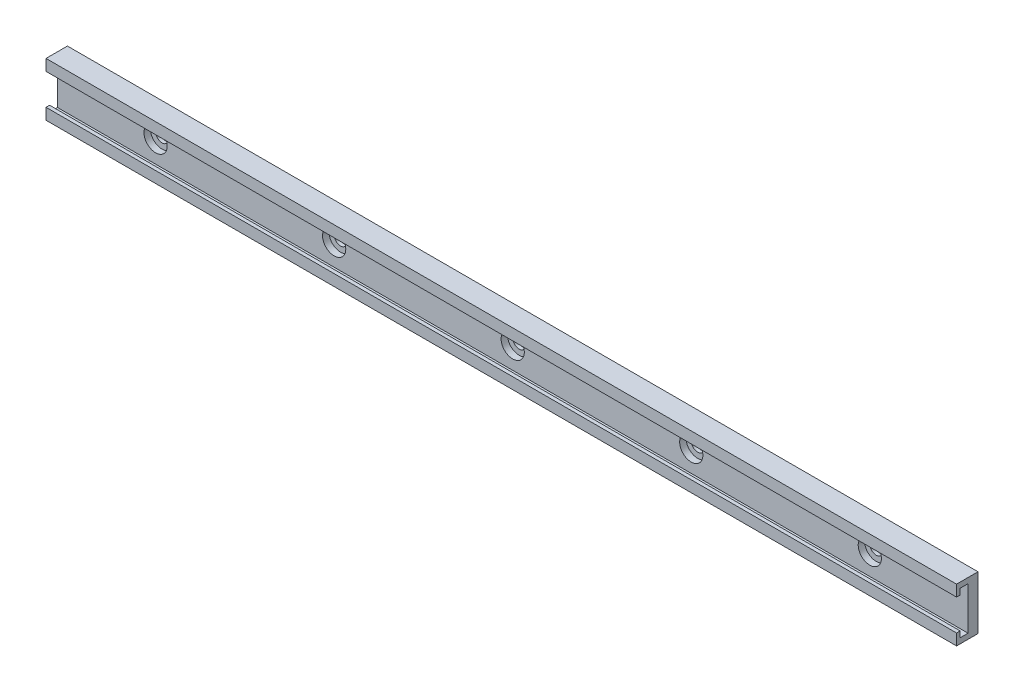
ISO-10303-21;
HEADER;
FILE_DESCRIPTION(('STEP AP214'),'2;1');
FILE_NAME('part.step','',(''),(''),'','','');
FILE_SCHEMA(('AUTOMOTIVE_DESIGN { 1 0 10303 214 1 1 1 1 }'));
ENDSEC;
DATA;
#1=APPLICATION_CONTEXT('core data for automotive mechanical design processes');
#2=APPLICATION_PROTOCOL_DEFINITION('international standard','automotive_design',2000,#1);
#3=PRODUCT_CONTEXT('',#1,'mechanical');
#4=PRODUCT('Part','Part','',(#3));
#5=PRODUCT_RELATED_PRODUCT_CATEGORY('part','',(#4));
#6=PRODUCT_DEFINITION_FORMATION('','',#4);
#7=PRODUCT_DEFINITION_CONTEXT('part definition',#1,'design');
#8=PRODUCT_DEFINITION('design','',#6,#7);
#9=PRODUCT_DEFINITION_SHAPE('','',#8);
#10=(LENGTH_UNIT() NAMED_UNIT(*) SI_UNIT(.MILLI.,.METRE.));
#11=(NAMED_UNIT(*) PLANE_ANGLE_UNIT() SI_UNIT($,.RADIAN.));
#12=(NAMED_UNIT(*) SI_UNIT($,.STERADIAN.) SOLID_ANGLE_UNIT());
#13=UNCERTAINTY_MEASURE_WITH_UNIT(LENGTH_MEASURE(1.E-05),#10,'distance_accuracy_value','');
#14=(GEOMETRIC_REPRESENTATION_CONTEXT(3) GLOBAL_UNCERTAINTY_ASSIGNED_CONTEXT((#13)) GLOBAL_UNIT_ASSIGNED_CONTEXT((#10,
#11,#12)) REPRESENTATION_CONTEXT('',''));
#15=CARTESIAN_POINT('',(0.,0.,0.));
#16=DIRECTION('',(0.,0.,1.));
#17=DIRECTION('',(1.,0.,0.));
#18=AXIS2_PLACEMENT_3D('',#15,#16,#17);
#19=CARTESIAN_POINT('',(127.5,0.,5.));
#20=DIRECTION('',(0.,0.,-1.));
#21=DIRECTION('',(-1.,0.,0.));
#22=AXIS2_PLACEMENT_3D('',#19,#20,#21);
#23=PLANE('',#22);
#24=DIRECTION('',(0.,-1.,0.));
#25=VECTOR('',#24,1.);
#26=CARTESIAN_POINT('',(-127.5,0.,5.));
#27=LINE('',#26,#25);
#28=CARTESIAN_POINT('',(-127.5,-4.35,5.));
#29=VERTEX_POINT('',#28);
#30=CARTESIAN_POINT('',(-127.5,-6.,5.));
#31=VERTEX_POINT('',#30);
#32=EDGE_CURVE('E165',#29,#31,#27,.T.);
#33=ORIENTED_EDGE('',*,*,#32,.F.);
#34=DIRECTION('',(-1.,0.,0.));
#35=VECTOR('',#34,1.);
#36=CARTESIAN_POINT('',(127.5,-4.35,5.));
#37=LINE('',#36,#35);
#38=CARTESIAN_POINT('',(127.5,-4.35,5.));
#39=VERTEX_POINT('',#38);
#40=EDGE_CURVE('E11',#39,#29,#37,.T.);
#41=ORIENTED_EDGE('',*,*,#40,.F.);
#42=DIRECTION('',(0.,-1.,0.));
#43=VECTOR('',#42,1.);
#44=CARTESIAN_POINT('',(127.5,0.,5.));
#45=LINE('',#44,#43);
#46=CARTESIAN_POINT('',(127.5,-6.,5.));
#47=VERTEX_POINT('',#46);
#48=EDGE_CURVE('E207',#39,#47,#45,.T.);
#49=ORIENTED_EDGE('',*,*,#48,.T.);
#50=DIRECTION('',(-1.,0.,0.));
#51=VECTOR('',#50,1.);
#52=CARTESIAN_POINT('',(127.5,-6.,5.));
#53=LINE('',#52,#51);
#54=EDGE_CURVE('E58',#47,#31,#53,.T.);
#55=ORIENTED_EDGE('',*,*,#54,.T.);
#56=EDGE_LOOP('',(#33,#41,#49,#55));
#57=FACE_BOUND('',#56,.T.);
#58=ADVANCED_FACE('F41',(#57),#23,.T.);
#59=CARTESIAN_POINT('',(127.5,-4.35,0.));
#60=DIRECTION('',(0.,-1.,0.));
#61=DIRECTION('',(0.,0.,-1.));
#62=AXIS2_PLACEMENT_3D('',#59,#60,#61);
#63=PLANE('',#62);
#64=DIRECTION('',(0.,0.,1.));
#65=VECTOR('',#64,1.);
#66=CARTESIAN_POINT('',(-127.5,-4.35,0.));
#67=LINE('',#66,#65);
#68=CARTESIAN_POINT('',(-127.5,-4.35,6.));
#69=VERTEX_POINT('',#68);
#70=EDGE_CURVE('E168',#29,#69,#67,.T.);
#71=ORIENTED_EDGE('',*,*,#70,.T.);
#72=DIRECTION('',(-1.,0.,0.));
#73=VECTOR('',#72,1.);
#74=CARTESIAN_POINT('',(127.5,-4.35,6.));
#75=LINE('',#74,#73);
#76=CARTESIAN_POINT('',(127.5,-4.35,6.));
#77=VERTEX_POINT('',#76);
#78=EDGE_CURVE('E50',#77,#69,#75,.T.);
#79=ORIENTED_EDGE('',*,*,#78,.F.);
#80=DIRECTION('',(0.,0.,1.));
#81=VECTOR('',#80,1.);
#82=CARTESIAN_POINT('',(127.5,-4.35,0.));
#83=LINE('',#82,#81);
#84=EDGE_CURVE('E261',#39,#77,#83,.T.);
#85=ORIENTED_EDGE('',*,*,#84,.F.);
#86=ORIENTED_EDGE('',*,*,#40,.T.);
#87=EDGE_LOOP('',(#71,#79,#85,#86));
#88=FACE_BOUND('',#87,.T.);
#89=ADVANCED_FACE('F297',(#88),#63,.F.);
#90=CARTESIAN_POINT('',(127.5,0.,6.));
#91=DIRECTION('',(0.,0.,-1.));
#92=DIRECTION('',(0.,1.,0.));
#93=AXIS2_PLACEMENT_3D('',#90,#91,#92);
#94=PLANE('',#93);
#95=DIRECTION('',(0.,-1.,0.));
#96=VECTOR('',#95,1.);
#97=CARTESIAN_POINT('',(-127.5,0.,6.));
#98=LINE('',#97,#96);
#99=CARTESIAN_POINT('',(-127.5,-7.5,6.));
#100=VERTEX_POINT('',#99);
#101=EDGE_CURVE('E172',#69,#100,#98,.T.);
#102=ORIENTED_EDGE('',*,*,#101,.T.);
#103=DIRECTION('',(-1.,0.,0.));
#104=VECTOR('',#103,1.);
#105=CARTESIAN_POINT('',(127.5,-7.5,6.));
#106=LINE('',#105,#104);
#107=CARTESIAN_POINT('',(127.5,-7.5,6.));
#108=VERTEX_POINT('',#107);
#109=EDGE_CURVE('E229',#108,#100,#106,.T.);
#110=ORIENTED_EDGE('',*,*,#109,.F.);
#111=DIRECTION('',(0.,-1.,0.));
#112=VECTOR('',#111,1.);
#113=CARTESIAN_POINT('',(127.5,0.,6.));
#114=LINE('',#113,#112);
#115=EDGE_CURVE('E240',#77,#108,#114,.T.);
#116=ORIENTED_EDGE('',*,*,#115,.F.);
#117=ORIENTED_EDGE('',*,*,#78,.T.);
#118=EDGE_LOOP('',(#102,#110,#116,#117));
#119=FACE_BOUND('',#118,.T.);
#120=ADVANCED_FACE('F238',(#119),#94,.F.);
#121=CARTESIAN_POINT('',(127.5,-7.5,0.));
#122=DIRECTION('',(0.,1.,0.));
#123=DIRECTION('',(0.,0.,1.));
#124=AXIS2_PLACEMENT_3D('',#121,#122,#123);
#125=PLANE('',#124);
#126=DIRECTION('',(0.,0.,-1.));
#127=VECTOR('',#126,1.);
#128=CARTESIAN_POINT('',(-127.5,-7.5,0.));
#129=LINE('',#128,#127);
#130=CARTESIAN_POINT('',(-127.5,-7.5,0.));
#131=VERTEX_POINT('',#130);
#132=EDGE_CURVE('E175',#100,#131,#129,.T.);
#133=ORIENTED_EDGE('',*,*,#132,.T.);
#134=DIRECTION('',(-1.,0.,0.));
#135=VECTOR('',#134,1.);
#136=CARTESIAN_POINT('',(127.5,-7.5,0.));
#137=LINE('',#136,#135);
#138=CARTESIAN_POINT('',(127.5,-7.5,0.));
#139=VERTEX_POINT('',#138);
#140=EDGE_CURVE('E226',#139,#131,#137,.T.);
#141=ORIENTED_EDGE('',*,*,#140,.F.);
#142=DIRECTION('',(0.,0.,-1.));
#143=VECTOR('',#142,1.);
#144=CARTESIAN_POINT('',(127.5,-7.5,0.));
#145=LINE('',#144,#143);
#146=EDGE_CURVE('E252',#108,#139,#145,.T.);
#147=ORIENTED_EDGE('',*,*,#146,.F.);
#148=ORIENTED_EDGE('',*,*,#109,.T.);
#149=EDGE_LOOP('',(#133,#141,#147,#148));
#150=FACE_BOUND('',#149,.T.);
#151=ADVANCED_FACE('F249',(#150),#125,.F.);
#152=CARTESIAN_POINT('',(127.5,0.,0.));
#153=DIRECTION('',(0.,0.,-1.));
#154=DIRECTION('',(-1.,0.,0.));
#155=AXIS2_PLACEMENT_3D('',#152,#153,#154);
#156=PLANE('',#155);
#157=CARTESIAN_POINT('',(-100.,0.,0.));
#158=DIRECTION('',(0.,0.,1.));
#159=DIRECTION('',(1.,0.,0.));
#160=AXIS2_PLACEMENT_3D('',#157,#158,#159);
#161=CIRCLE('',#160,1.75000000000002);
#162=CARTESIAN_POINT('',(-98.25,0.,0.));
#163=VERTEX_POINT('',#162);
#164=EDGE_CURVE('E391',#163,#163,#161,.T.);
#165=ORIENTED_EDGE('',*,*,#164,.T.);
#166=EDGE_LOOP('',(#165));
#167=FACE_BOUND('',#166,.T.);
#168=CARTESIAN_POINT('',(-50.,0.,0.));
#169=DIRECTION('',(0.,0.,1.));
#170=DIRECTION('',(1.,0.,0.));
#171=AXIS2_PLACEMENT_3D('',#168,#169,#170);
#172=CIRCLE('',#171,1.75000000000002);
#173=CARTESIAN_POINT('',(-48.25,0.,0.));
#174=VERTEX_POINT('',#173);
#175=EDGE_CURVE('E407',#174,#174,#172,.T.);
#176=ORIENTED_EDGE('',*,*,#175,.T.);
#177=EDGE_LOOP('',(#176));
#178=FACE_BOUND('',#177,.T.);
#179=CARTESIAN_POINT('',(0.,0.,0.));
#180=DIRECTION('',(0.,0.,1.));
#181=DIRECTION('',(1.,0.,0.));
#182=AXIS2_PLACEMENT_3D('',#179,#180,#181);
#183=CIRCLE('',#182,1.75000000000001);
#184=CARTESIAN_POINT('',(1.75000000000001,0.,0.));
#185=VERTEX_POINT('',#184);
#186=EDGE_CURVE('E423',#185,#185,#183,.T.);
#187=ORIENTED_EDGE('',*,*,#186,.T.);
#188=EDGE_LOOP('',(#187));
#189=FACE_BOUND('',#188,.T.);
#190=CARTESIAN_POINT('',(50.,0.,0.));
#191=DIRECTION('',(0.,0.,1.));
#192=DIRECTION('',(1.,0.,0.));
#193=AXIS2_PLACEMENT_3D('',#190,#191,#192);
#194=CIRCLE('',#193,1.75000000000002);
#195=CARTESIAN_POINT('',(51.75,0.,0.));
#196=VERTEX_POINT('',#195);
#197=EDGE_CURVE('E439',#196,#196,#194,.T.);
#198=ORIENTED_EDGE('',*,*,#197,.T.);
#199=EDGE_LOOP('',(#198));
#200=FACE_BOUND('',#199,.T.);
#201=CARTESIAN_POINT('',(100.,0.,0.));
#202=DIRECTION('',(0.,0.,1.));
#203=DIRECTION('',(1.,0.,0.));
#204=AXIS2_PLACEMENT_3D('',#201,#202,#203);
#205=CIRCLE('',#204,1.75000000000002);
#206=CARTESIAN_POINT('',(101.75,0.,0.));
#207=VERTEX_POINT('',#206);
#208=EDGE_CURVE('E169',#207,#207,#205,.T.);
#209=ORIENTED_EDGE('',*,*,#208,.T.);
#210=EDGE_LOOP('',(#209));
#211=FACE_BOUND('',#210,.T.);
#212=DIRECTION('',(0.,-1.,0.));
#213=VECTOR('',#212,1.);
#214=CARTESIAN_POINT('',(-127.5,0.,0.));
#215=LINE('',#214,#213);
#216=CARTESIAN_POINT('',(-127.5,7.5,0.));
#217=VERTEX_POINT('',#216);
#218=EDGE_CURVE('E179',#217,#131,#215,.T.);
#219=ORIENTED_EDGE('',*,*,#218,.F.);
#220=DIRECTION('',(-1.,0.,0.));
#221=VECTOR('',#220,1.);
#222=CARTESIAN_POINT('',(127.5,7.5,0.));
#223=LINE('',#222,#221);
#224=CARTESIAN_POINT('',(127.5,7.5,0.));
#225=VERTEX_POINT('',#224);
#226=EDGE_CURVE('E223',#225,#217,#223,.T.);
#227=ORIENTED_EDGE('',*,*,#226,.F.);
#228=DIRECTION('',(0.,-1.,0.));
#229=VECTOR('',#228,1.);
#230=CARTESIAN_POINT('',(127.5,0.,0.));
#231=LINE('',#230,#229);
#232=EDGE_CURVE('E255',#225,#139,#231,.T.);
#233=ORIENTED_EDGE('',*,*,#232,.T.);
#234=ORIENTED_EDGE('',*,*,#140,.T.);
#235=EDGE_LOOP('',(#219,#227,#233,#234));
#236=FACE_BOUND('',#235,.T.);
#237=ADVANCED_FACE('F462',(#167,#178,#189,#200,#211,#236),#156,.T.);
#238=CARTESIAN_POINT('',(127.5,7.5,0.));
#239=DIRECTION('',(0.,1.,0.));
#240=DIRECTION('',(0.,0.,1.));
#241=AXIS2_PLACEMENT_3D('',#238,#239,#240);
#242=PLANE('',#241);
#243=DIRECTION('',(0.,0.,-1.));
#244=VECTOR('',#243,1.);
#245=CARTESIAN_POINT('',(-127.5,7.5,0.));
#246=LINE('',#245,#244);
#247=CARTESIAN_POINT('',(-127.5,7.5,6.));
#248=VERTEX_POINT('',#247);
#249=EDGE_CURVE('E183',#248,#217,#246,.T.);
#250=ORIENTED_EDGE('',*,*,#249,.F.);
#251=DIRECTION('',(-1.,0.,0.));
#252=VECTOR('',#251,1.);
#253=CARTESIAN_POINT('',(127.5,7.5,6.));
#254=LINE('',#253,#252);
#255=CARTESIAN_POINT('',(127.5,7.5,6.));
#256=VERTEX_POINT('',#255);
#257=EDGE_CURVE('E220',#256,#248,#254,.T.);
#258=ORIENTED_EDGE('',*,*,#257,.F.);
#259=DIRECTION('',(0.,0.,-1.));
#260=VECTOR('',#259,1.);
#261=CARTESIAN_POINT('',(127.5,7.5,0.));
#262=LINE('',#261,#260);
#263=EDGE_CURVE('E259',#256,#225,#262,.T.);
#264=ORIENTED_EDGE('',*,*,#263,.T.);
#265=ORIENTED_EDGE('',*,*,#226,.T.);
#266=EDGE_LOOP('',(#250,#258,#264,#265));
#267=FACE_BOUND('',#266,.T.);
#268=ADVANCED_FACE('F472',(#267),#242,.T.);
#269=CARTESIAN_POINT('',(127.5,0.,6.));
#270=DIRECTION('',(0.,0.,1.));
#271=DIRECTION('',(0.,-1.,0.));
#272=AXIS2_PLACEMENT_3D('',#269,#270,#271);
#273=PLANE('',#272);
#274=DIRECTION('',(0.,1.,0.));
#275=VECTOR('',#274,1.);
#276=CARTESIAN_POINT('',(-127.5,0.,6.));
#277=LINE('',#276,#275);
#278=CARTESIAN_POINT('',(-127.5,4.35,6.));
#279=VERTEX_POINT('',#278);
#280=EDGE_CURVE('E187',#279,#248,#277,.T.);
#281=ORIENTED_EDGE('',*,*,#280,.F.);
#282=DIRECTION('',(-1.,0.,0.));
#283=VECTOR('',#282,1.);
#284=CARTESIAN_POINT('',(127.5,4.35,6.));
#285=LINE('',#284,#283);
#286=CARTESIAN_POINT('',(127.5,4.35,6.));
#287=VERTEX_POINT('',#286);
#288=EDGE_CURVE('E217',#287,#279,#285,.T.);
#289=ORIENTED_EDGE('',*,*,#288,.F.);
#290=DIRECTION('',(0.,1.,0.));
#291=VECTOR('',#290,1.);
#292=CARTESIAN_POINT('',(127.5,0.,6.));
#293=LINE('',#292,#291);
#294=EDGE_CURVE('E268',#287,#256,#293,.T.);
#295=ORIENTED_EDGE('',*,*,#294,.T.);
#296=ORIENTED_EDGE('',*,*,#257,.T.);
#297=EDGE_LOOP('',(#281,#289,#295,#296));
#298=FACE_BOUND('',#297,.T.);
#299=ADVANCED_FACE('F283',(#298),#273,.T.);
#300=CARTESIAN_POINT('',(127.5,4.35,0.));
#301=DIRECTION('',(0.,-1.,0.));
#302=DIRECTION('',(0.,0.,-1.));
#303=AXIS2_PLACEMENT_3D('',#300,#301,#302);
#304=PLANE('',#303);
#305=DIRECTION('',(0.,0.,1.));
#306=VECTOR('',#305,1.);
#307=CARTESIAN_POINT('',(-127.5,4.35,0.));
#308=LINE('',#307,#306);
#309=CARTESIAN_POINT('',(-127.5,4.35,5.));
#310=VERTEX_POINT('',#309);
#311=EDGE_CURVE('E191',#310,#279,#308,.T.);
#312=ORIENTED_EDGE('',*,*,#311,.F.);
#313=DIRECTION('',(-1.,0.,0.));
#314=VECTOR('',#313,1.);
#315=CARTESIAN_POINT('',(127.5,4.35,5.));
#316=LINE('',#315,#314);
#317=CARTESIAN_POINT('',(127.5,4.35,5.));
#318=VERTEX_POINT('',#317);
#319=EDGE_CURVE('E214',#318,#310,#316,.T.);
#320=ORIENTED_EDGE('',*,*,#319,.F.);
#321=DIRECTION('',(0.,0.,1.));
#322=VECTOR('',#321,1.);
#323=CARTESIAN_POINT('',(127.5,4.35,0.));
#324=LINE('',#323,#322);
#325=EDGE_CURVE('E272',#318,#287,#324,.T.);
#326=ORIENTED_EDGE('',*,*,#325,.T.);
#327=ORIENTED_EDGE('',*,*,#288,.T.);
#328=EDGE_LOOP('',(#312,#320,#326,#327));
#329=FACE_BOUND('',#328,.T.);
#330=ADVANCED_FACE('F278',(#329),#304,.T.);
#331=CARTESIAN_POINT('',(127.5,0.,5.));
#332=DIRECTION('',(0.,0.,1.));
#333=DIRECTION('',(1.,0.,0.));
#334=AXIS2_PLACEMENT_3D('',#331,#332,#333);
#335=PLANE('',#334);
#336=DIRECTION('',(0.,1.,0.));
#337=VECTOR('',#336,1.);
#338=CARTESIAN_POINT('',(-127.5,0.,5.));
#339=LINE('',#338,#337);
#340=CARTESIAN_POINT('',(-127.5,6.,5.));
#341=VERTEX_POINT('',#340);
#342=EDGE_CURVE('E195',#310,#341,#339,.T.);
#343=ORIENTED_EDGE('',*,*,#342,.T.);
#344=DIRECTION('',(-1.,0.,0.));
#345=VECTOR('',#344,1.);
#346=CARTESIAN_POINT('',(127.5,6.,5.));
#347=LINE('',#346,#345);
#348=CARTESIAN_POINT('',(127.5,6.,5.));
#349=VERTEX_POINT('',#348);
#350=EDGE_CURVE('E155',#349,#341,#347,.T.);
#351=ORIENTED_EDGE('',*,*,#350,.F.);
#352=DIRECTION('',(0.,1.,0.));
#353=VECTOR('',#352,1.);
#354=CARTESIAN_POINT('',(127.5,0.,5.));
#355=LINE('',#354,#353);
#356=EDGE_CURVE('E141',#318,#349,#355,.T.);
#357=ORIENTED_EDGE('',*,*,#356,.F.);
#358=ORIENTED_EDGE('',*,*,#319,.T.);
#359=EDGE_LOOP('',(#343,#351,#357,#358));
#360=FACE_BOUND('',#359,.T.);
#361=ADVANCED_FACE('F287',(#360),#335,.F.);
#362=CARTESIAN_POINT('',(127.5,6.,0.));
#363=DIRECTION('',(0.,1.,0.));
#364=DIRECTION('',(0.,0.,1.));
#365=AXIS2_PLACEMENT_3D('',#362,#363,#364);
#366=PLANE('',#365);
#367=DIRECTION('',(0.,0.,-1.));
#368=VECTOR('',#367,1.);
#369=CARTESIAN_POINT('',(-127.5,6.,0.));
#370=LINE('',#369,#368);
#371=CARTESIAN_POINT('',(-127.5,6.,2.8));
#372=VERTEX_POINT('',#371);
#373=EDGE_CURVE('E151',#341,#372,#370,.T.);
#374=ORIENTED_EDGE('',*,*,#373,.T.);
#375=DIRECTION('',(-1.,0.,0.));
#376=VECTOR('',#375,1.);
#377=CARTESIAN_POINT('',(127.5,6.,2.8));
#378=LINE('',#377,#376);
#379=CARTESIAN_POINT('',(127.5,6.,2.8));
#380=VERTEX_POINT('',#379);
#381=EDGE_CURVE('E148',#380,#372,#378,.T.);
#382=ORIENTED_EDGE('',*,*,#381,.F.);
#383=DIRECTION('',(0.,0.,-1.));
#384=VECTOR('',#383,1.);
#385=CARTESIAN_POINT('',(127.5,6.,0.));
#386=LINE('',#385,#384);
#387=EDGE_CURVE('E132',#349,#380,#386,.T.);
#388=ORIENTED_EDGE('',*,*,#387,.F.);
#389=ORIENTED_EDGE('',*,*,#350,.T.);
#390=EDGE_LOOP('',(#374,#382,#388,#389));
#391=FACE_BOUND('',#390,.T.);
#392=ADVANCED_FACE('F149',(#391),#366,.F.);
#393=CARTESIAN_POINT('',(127.5,0.,2.8));
#394=DIRECTION('',(0.,0.,-1.));
#395=DIRECTION('',(-1.,0.,0.));
#396=AXIS2_PLACEMENT_3D('',#393,#394,#395);
#397=PLANE('',#396);
#398=CARTESIAN_POINT('',(-100.,0.,2.8));
#399=DIRECTION('',(0.,0.,1.));
#400=DIRECTION('',(1.,0.,0.));
#401=AXIS2_PLACEMENT_3D('',#398,#399,#400);
#402=CIRCLE('',#401,3.25000000000002);
#403=CARTESIAN_POINT('',(-96.75,0.,2.8));
#404=VERTEX_POINT('',#403);
#405=EDGE_CURVE('E381',#404,#404,#402,.T.);
#406=ORIENTED_EDGE('',*,*,#405,.F.);
#407=EDGE_LOOP('',(#406));
#408=FACE_BOUND('',#407,.T.);
#409=CARTESIAN_POINT('',(-50.,0.,2.8));
#410=DIRECTION('',(0.,0.,1.));
#411=DIRECTION('',(1.,0.,0.));
#412=AXIS2_PLACEMENT_3D('',#409,#410,#411);
#413=CIRCLE('',#412,3.25000000000002);
#414=CARTESIAN_POINT('',(-46.75,0.,2.8));
#415=VERTEX_POINT('',#414);
#416=EDGE_CURVE('E395',#415,#415,#413,.T.);
#417=ORIENTED_EDGE('',*,*,#416,.F.);
#418=EDGE_LOOP('',(#417));
#419=FACE_BOUND('',#418,.T.);
#420=CARTESIAN_POINT('',(0.,0.,2.8));
#421=DIRECTION('',(0.,0.,1.));
#422=DIRECTION('',(1.,0.,0.));
#423=AXIS2_PLACEMENT_3D('',#420,#421,#422);
#424=CIRCLE('',#423,3.25000000000001);
#425=CARTESIAN_POINT('',(3.25000000000001,0.,2.8));
#426=VERTEX_POINT('',#425);
#427=EDGE_CURVE('E411',#426,#426,#424,.T.);
#428=ORIENTED_EDGE('',*,*,#427,.F.);
#429=EDGE_LOOP('',(#428));
#430=FACE_BOUND('',#429,.T.);
#431=CARTESIAN_POINT('',(50.,0.,2.8));
#432=DIRECTION('',(0.,0.,1.));
#433=DIRECTION('',(1.,0.,0.));
#434=AXIS2_PLACEMENT_3D('',#431,#432,#433);
#435=CIRCLE('',#434,3.25000000000002);
#436=CARTESIAN_POINT('',(53.25,0.,2.8));
#437=VERTEX_POINT('',#436);
#438=EDGE_CURVE('E427',#437,#437,#435,.T.);
#439=ORIENTED_EDGE('',*,*,#438,.F.);
#440=EDGE_LOOP('',(#439));
#441=FACE_BOUND('',#440,.T.);
#442=CARTESIAN_POINT('',(100.,0.,2.8));
#443=DIRECTION('',(0.,0.,1.));
#444=DIRECTION('',(1.,0.,0.));
#445=AXIS2_PLACEMENT_3D('',#442,#443,#444);
#446=CIRCLE('',#445,3.25000000000002);
#447=CARTESIAN_POINT('',(103.25,0.,2.8));
#448=VERTEX_POINT('',#447);
#449=EDGE_CURVE('E443',#448,#448,#446,.T.);
#450=ORIENTED_EDGE('',*,*,#449,.F.);
#451=EDGE_LOOP('',(#450));
#452=FACE_BOUND('',#451,.T.);
#453=DIRECTION('',(0.,-1.,0.));
#454=VECTOR('',#453,1.);
#455=CARTESIAN_POINT('',(-127.5,0.,2.8));
#456=LINE('',#455,#454);
#457=CARTESIAN_POINT('',(-127.5,-6.,2.8));
#458=VERTEX_POINT('',#457);
#459=EDGE_CURVE('E200',#372,#458,#456,.T.);
#460=ORIENTED_EDGE('',*,*,#459,.T.);
#461=DIRECTION('',(-1.,0.,0.));
#462=VECTOR('',#461,1.);
#463=CARTESIAN_POINT('',(127.5,-6.,2.8));
#464=LINE('',#463,#462);
#465=CARTESIAN_POINT('',(127.5,-6.,2.8));
#466=VERTEX_POINT('',#465);
#467=EDGE_CURVE('E96',#466,#458,#464,.T.);
#468=ORIENTED_EDGE('',*,*,#467,.F.);
#469=DIRECTION('',(0.,-1.,0.));
#470=VECTOR('',#469,1.);
#471=CARTESIAN_POINT('',(127.5,0.,2.8));
#472=LINE('',#471,#470);
#473=EDGE_CURVE('E138',#380,#466,#472,.T.);
#474=ORIENTED_EDGE('',*,*,#473,.F.);
#475=ORIENTED_EDGE('',*,*,#381,.T.);
#476=EDGE_LOOP('',(#460,#468,#474,#475));
#477=FACE_BOUND('',#476,.T.);
#478=ADVANCED_FACE('F157',(#408,#419,#430,#441,#452,#477),#397,.F.);
#479=CARTESIAN_POINT('',(127.5,-6.,0.));
#480=DIRECTION('',(0.,1.,0.));
#481=DIRECTION('',(0.,0.,1.));
#482=AXIS2_PLACEMENT_3D('',#479,#480,#481);
#483=PLANE('',#482);
#484=DIRECTION('',(0.,0.,-1.));
#485=VECTOR('',#484,1.);
#486=CARTESIAN_POINT('',(-127.5,-6.,0.));
#487=LINE('',#486,#485);
#488=EDGE_CURVE('E203',#31,#458,#487,.T.);
#489=ORIENTED_EDGE('',*,*,#488,.F.);
#490=ORIENTED_EDGE('',*,*,#54,.F.);
#491=DIRECTION('',(0.,0.,-1.));
#492=VECTOR('',#491,1.);
#493=CARTESIAN_POINT('',(127.5,-6.,0.));
#494=LINE('',#493,#492);
#495=EDGE_CURVE('E159',#47,#466,#494,.T.);
#496=ORIENTED_EDGE('',*,*,#495,.T.);
#497=ORIENTED_EDGE('',*,*,#467,.T.);
#498=EDGE_LOOP('',(#489,#490,#496,#497));
#499=FACE_BOUND('',#498,.T.);
#500=ADVANCED_FACE('F301',(#499),#483,.T.);
#501=CARTESIAN_POINT('',(127.5,0.,0.));
#502=DIRECTION('',(1.,0.,0.));
#503=DIRECTION('',(0.,0.,-1.));
#504=AXIS2_PLACEMENT_3D('',#501,#502,#503);
#505=PLANE('',#504);
#506=ORIENTED_EDGE('',*,*,#48,.F.);
#507=ORIENTED_EDGE('',*,*,#84,.T.);
#508=ORIENTED_EDGE('',*,*,#115,.T.);
#509=ORIENTED_EDGE('',*,*,#146,.T.);
#510=ORIENTED_EDGE('',*,*,#232,.F.);
#511=ORIENTED_EDGE('',*,*,#263,.F.);
#512=ORIENTED_EDGE('',*,*,#294,.F.);
#513=ORIENTED_EDGE('',*,*,#325,.F.);
#514=ORIENTED_EDGE('',*,*,#356,.T.);
#515=ORIENTED_EDGE('',*,*,#387,.T.);
#516=ORIENTED_EDGE('',*,*,#473,.T.);
#517=ORIENTED_EDGE('',*,*,#495,.F.);
#518=EDGE_LOOP('',(#506,#507,#508,#509,#510,#511,#512,#513,#514,#515,#516,#517));
#519=FACE_BOUND('',#518,.T.);
#520=ADVANCED_FACE('F135',(#519),#505,.T.);
#521=CARTESIAN_POINT('',(-127.5,0.,0.));
#522=DIRECTION('',(1.,0.,0.));
#523=DIRECTION('',(0.,0.,-1.));
#524=AXIS2_PLACEMENT_3D('',#521,#522,#523);
#525=PLANE('',#524);
#526=ORIENTED_EDGE('',*,*,#32,.T.);
#527=ORIENTED_EDGE('',*,*,#488,.T.);
#528=ORIENTED_EDGE('',*,*,#459,.F.);
#529=ORIENTED_EDGE('',*,*,#373,.F.);
#530=ORIENTED_EDGE('',*,*,#342,.F.);
#531=ORIENTED_EDGE('',*,*,#311,.T.);
#532=ORIENTED_EDGE('',*,*,#280,.T.);
#533=ORIENTED_EDGE('',*,*,#249,.T.);
#534=ORIENTED_EDGE('',*,*,#218,.T.);
#535=ORIENTED_EDGE('',*,*,#132,.F.);
#536=ORIENTED_EDGE('',*,*,#101,.F.);
#537=ORIENTED_EDGE('',*,*,#70,.F.);
#538=EDGE_LOOP('',(#526,#527,#528,#529,#530,#531,#532,#533,#534,#535,#536,#537));
#539=FACE_BOUND('',#538,.T.);
#540=ADVANCED_FACE('F245',(#539),#525,.F.);
#541=CARTESIAN_POINT('',(100.,0.,2.8));
#542=DIRECTION('',(0.,0.,1.));
#543=DIRECTION('',(1.,0.,0.));
#544=AXIS2_PLACEMENT_3D('',#541,#542,#543);
#545=CYLINDRICAL_SURFACE('',#544,1.75000000000002);
#546=ORIENTED_EDGE('',*,*,#208,.F.);
#547=EDGE_LOOP('',(#546));
#548=FACE_BOUND('',#547,.T.);
#549=CARTESIAN_POINT('',(100.,0.,0.999999999999999));
#550=DIRECTION('',(0.,0.,1.));
#551=DIRECTION('',(1.,0.,0.));
#552=AXIS2_PLACEMENT_3D('',#549,#550,#551);
#553=CIRCLE('',#552,1.75000000000002);
#554=CARTESIAN_POINT('',(101.75,0.,0.999999999999999));
#555=VERTEX_POINT('',#554);
#556=EDGE_CURVE('E451',#555,#555,#553,.T.);
#557=ORIENTED_EDGE('',*,*,#556,.T.);
#558=EDGE_LOOP('',(#557));
#559=FACE_BOUND('',#558,.T.);
#560=ADVANCED_FACE('F313',(#548,#559),#545,.F.);
#561=CARTESIAN_POINT('',(101.75,0.,0.999999999999999));
#562=DIRECTION('',(0.,0.,-1.));
#563=DIRECTION('',(-1.,0.,0.));
#564=AXIS2_PLACEMENT_3D('',#561,#562,#563);
#565=PLANE('',#564);
#566=ORIENTED_EDGE('',*,*,#556,.F.);
#567=EDGE_LOOP('',(#566));
#568=FACE_BOUND('',#567,.T.);
#569=CARTESIAN_POINT('',(100.,0.,0.999999999999999));
#570=DIRECTION('',(0.,0.,1.));
#571=DIRECTION('',(1.,0.,0.));
#572=AXIS2_PLACEMENT_3D('',#569,#570,#571);
#573=CIRCLE('',#572,3.25000000000002);
#574=CARTESIAN_POINT('',(103.25,0.,0.999999999999999));
#575=VERTEX_POINT('',#574);
#576=EDGE_CURVE('E447',#575,#575,#573,.T.);
#577=ORIENTED_EDGE('',*,*,#576,.T.);
#578=EDGE_LOOP('',(#577));
#579=FACE_BOUND('',#578,.T.);
#580=ADVANCED_FACE('F317',(#568,#579),#565,.F.);
#581=CARTESIAN_POINT('',(100.,0.,2.8));
#582=DIRECTION('',(0.,0.,1.));
#583=DIRECTION('',(1.,0.,0.));
#584=AXIS2_PLACEMENT_3D('',#581,#582,#583);
#585=CYLINDRICAL_SURFACE('',#584,3.25000000000002);
#586=ORIENTED_EDGE('',*,*,#576,.F.);
#587=EDGE_LOOP('',(#586));
#588=FACE_BOUND('',#587,.T.);
#589=ORIENTED_EDGE('',*,*,#449,.T.);
#590=EDGE_LOOP('',(#589));
#591=FACE_BOUND('',#590,.T.);
#592=ADVANCED_FACE('F321',(#588,#591),#585,.F.);
#593=CARTESIAN_POINT('',(50.,0.,2.8));
#594=DIRECTION('',(0.,0.,1.));
#595=DIRECTION('',(1.,0.,0.));
#596=AXIS2_PLACEMENT_3D('',#593,#594,#595);
#597=CYLINDRICAL_SURFACE('',#596,1.75000000000002);
#598=ORIENTED_EDGE('',*,*,#197,.F.);
#599=EDGE_LOOP('',(#598));
#600=FACE_BOUND('',#599,.T.);
#601=CARTESIAN_POINT('',(50.,0.,0.999999999999999));
#602=DIRECTION('',(0.,0.,1.));
#603=DIRECTION('',(1.,0.,0.));
#604=AXIS2_PLACEMENT_3D('',#601,#602,#603);
#605=CIRCLE('',#604,1.75000000000002);
#606=CARTESIAN_POINT('',(51.75,0.,0.999999999999999));
#607=VERTEX_POINT('',#606);
#608=EDGE_CURVE('E435',#607,#607,#605,.T.);
#609=ORIENTED_EDGE('',*,*,#608,.T.);
#610=EDGE_LOOP('',(#609));
#611=FACE_BOUND('',#610,.T.);
#612=ADVANCED_FACE('F325',(#600,#611),#597,.F.);
#613=CARTESIAN_POINT('',(51.75,0.,0.999999999999999));
#614=DIRECTION('',(0.,0.,-1.));
#615=DIRECTION('',(-1.,0.,0.));
#616=AXIS2_PLACEMENT_3D('',#613,#614,#615);
#617=PLANE('',#616);
#618=ORIENTED_EDGE('',*,*,#608,.F.);
#619=EDGE_LOOP('',(#618));
#620=FACE_BOUND('',#619,.T.);
#621=CARTESIAN_POINT('',(50.,0.,0.999999999999999));
#622=DIRECTION('',(0.,0.,1.));
#623=DIRECTION('',(1.,0.,0.));
#624=AXIS2_PLACEMENT_3D('',#621,#622,#623);
#625=CIRCLE('',#624,3.25000000000001);
#626=CARTESIAN_POINT('',(53.25,0.,0.999999999999999));
#627=VERTEX_POINT('',#626);
#628=EDGE_CURVE('E431',#627,#627,#625,.T.);
#629=ORIENTED_EDGE('',*,*,#628,.T.);
#630=EDGE_LOOP('',(#629));
#631=FACE_BOUND('',#630,.T.);
#632=ADVANCED_FACE('F329',(#620,#631),#617,.F.);
#633=CARTESIAN_POINT('',(50.,0.,2.8));
#634=DIRECTION('',(0.,0.,1.));
#635=DIRECTION('',(1.,0.,0.));
#636=AXIS2_PLACEMENT_3D('',#633,#634,#635);
#637=CYLINDRICAL_SURFACE('',#636,3.25000000000001);
#638=ORIENTED_EDGE('',*,*,#628,.F.);
#639=EDGE_LOOP('',(#638));
#640=FACE_BOUND('',#639,.T.);
#641=ORIENTED_EDGE('',*,*,#438,.T.);
#642=EDGE_LOOP('',(#641));
#643=FACE_BOUND('',#642,.T.);
#644=ADVANCED_FACE('F333',(#640,#643),#637,.F.);
#645=CARTESIAN_POINT('',(0.,0.,2.8));
#646=DIRECTION('',(0.,0.,1.));
#647=DIRECTION('',(1.,0.,0.));
#648=AXIS2_PLACEMENT_3D('',#645,#646,#647);
#649=CYLINDRICAL_SURFACE('',#648,1.75000000000001);
#650=ORIENTED_EDGE('',*,*,#186,.F.);
#651=EDGE_LOOP('',(#650));
#652=FACE_BOUND('',#651,.T.);
#653=CARTESIAN_POINT('',(0.,0.,0.999999999999999));
#654=DIRECTION('',(0.,0.,1.));
#655=DIRECTION('',(1.,0.,0.));
#656=AXIS2_PLACEMENT_3D('',#653,#654,#655);
#657=CIRCLE('',#656,1.75000000000001);
#658=CARTESIAN_POINT('',(1.75000000000001,0.,0.999999999999999));
#659=VERTEX_POINT('',#658);
#660=EDGE_CURVE('E419',#659,#659,#657,.T.);
#661=ORIENTED_EDGE('',*,*,#660,.T.);
#662=EDGE_LOOP('',(#661));
#663=FACE_BOUND('',#662,.T.);
#664=ADVANCED_FACE('F337',(#652,#663),#649,.F.);
#665=CARTESIAN_POINT('',(1.75000000000001,0.,0.999999999999999));
#666=DIRECTION('',(0.,0.,-1.));
#667=DIRECTION('',(-1.,0.,0.));
#668=AXIS2_PLACEMENT_3D('',#665,#666,#667);
#669=PLANE('',#668);
#670=ORIENTED_EDGE('',*,*,#660,.F.);
#671=EDGE_LOOP('',(#670));
#672=FACE_BOUND('',#671,.T.);
#673=CARTESIAN_POINT('',(0.,0.,0.999999999999999));
#674=DIRECTION('',(0.,0.,1.));
#675=DIRECTION('',(1.,0.,0.));
#676=AXIS2_PLACEMENT_3D('',#673,#674,#675);
#677=CIRCLE('',#676,3.25000000000001);
#678=CARTESIAN_POINT('',(3.25000000000001,0.,0.999999999999999));
#679=VERTEX_POINT('',#678);
#680=EDGE_CURVE('E415',#679,#679,#677,.T.);
#681=ORIENTED_EDGE('',*,*,#680,.T.);
#682=EDGE_LOOP('',(#681));
#683=FACE_BOUND('',#682,.T.);
#684=ADVANCED_FACE('F341',(#672,#683),#669,.F.);
#685=CARTESIAN_POINT('',(0.,0.,2.8));
#686=DIRECTION('',(0.,0.,1.));
#687=DIRECTION('',(1.,0.,0.));
#688=AXIS2_PLACEMENT_3D('',#685,#686,#687);
#689=CYLINDRICAL_SURFACE('',#688,3.25000000000001);
#690=ORIENTED_EDGE('',*,*,#680,.F.);
#691=EDGE_LOOP('',(#690));
#692=FACE_BOUND('',#691,.T.);
#693=ORIENTED_EDGE('',*,*,#427,.T.);
#694=EDGE_LOOP('',(#693));
#695=FACE_BOUND('',#694,.T.);
#696=ADVANCED_FACE('F345',(#692,#695),#689,.F.);
#697=CARTESIAN_POINT('',(-50.,0.,2.8));
#698=DIRECTION('',(0.,0.,1.));
#699=DIRECTION('',(1.,0.,0.));
#700=AXIS2_PLACEMENT_3D('',#697,#698,#699);
#701=CYLINDRICAL_SURFACE('',#700,1.75000000000002);
#702=ORIENTED_EDGE('',*,*,#175,.F.);
#703=EDGE_LOOP('',(#702));
#704=FACE_BOUND('',#703,.T.);
#705=CARTESIAN_POINT('',(-50.,0.,0.999999999999999));
#706=DIRECTION('',(0.,0.,1.));
#707=DIRECTION('',(1.,0.,0.));
#708=AXIS2_PLACEMENT_3D('',#705,#706,#707);
#709=CIRCLE('',#708,1.75000000000002);
#710=CARTESIAN_POINT('',(-48.25,0.,0.999999999999999));
#711=VERTEX_POINT('',#710);
#712=EDGE_CURVE('E403',#711,#711,#709,.T.);
#713=ORIENTED_EDGE('',*,*,#712,.T.);
#714=EDGE_LOOP('',(#713));
#715=FACE_BOUND('',#714,.T.);
#716=ADVANCED_FACE('F349',(#704,#715),#701,.F.);
#717=CARTESIAN_POINT('',(-48.25,0.,0.999999999999999));
#718=DIRECTION('',(0.,0.,-1.));
#719=DIRECTION('',(-1.,0.,0.));
#720=AXIS2_PLACEMENT_3D('',#717,#718,#719);
#721=PLANE('',#720);
#722=ORIENTED_EDGE('',*,*,#712,.F.);
#723=EDGE_LOOP('',(#722));
#724=FACE_BOUND('',#723,.T.);
#725=CARTESIAN_POINT('',(-50.,0.,0.999999999999999));
#726=DIRECTION('',(0.,0.,1.));
#727=DIRECTION('',(1.,0.,0.));
#728=AXIS2_PLACEMENT_3D('',#725,#726,#727);
#729=CIRCLE('',#728,3.25000000000001);
#730=CARTESIAN_POINT('',(-46.75,0.,0.999999999999999));
#731=VERTEX_POINT('',#730);
#732=EDGE_CURVE('E399',#731,#731,#729,.T.);
#733=ORIENTED_EDGE('',*,*,#732,.T.);
#734=EDGE_LOOP('',(#733));
#735=FACE_BOUND('',#734,.T.);
#736=ADVANCED_FACE('F353',(#724,#735),#721,.F.);
#737=CARTESIAN_POINT('',(-50.,0.,2.8));
#738=DIRECTION('',(0.,0.,1.));
#739=DIRECTION('',(1.,0.,0.));
#740=AXIS2_PLACEMENT_3D('',#737,#738,#739);
#741=CYLINDRICAL_SURFACE('',#740,3.25000000000001);
#742=ORIENTED_EDGE('',*,*,#732,.F.);
#743=EDGE_LOOP('',(#742));
#744=FACE_BOUND('',#743,.T.);
#745=ORIENTED_EDGE('',*,*,#416,.T.);
#746=EDGE_LOOP('',(#745));
#747=FACE_BOUND('',#746,.T.);
#748=ADVANCED_FACE('F357',(#744,#747),#741,.F.);
#749=CARTESIAN_POINT('',(-100.,0.,2.8));
#750=DIRECTION('',(0.,0.,1.));
#751=DIRECTION('',(1.,0.,0.));
#752=AXIS2_PLACEMENT_3D('',#749,#750,#751);
#753=CYLINDRICAL_SURFACE('',#752,1.75000000000002);
#754=ORIENTED_EDGE('',*,*,#164,.F.);
#755=EDGE_LOOP('',(#754));
#756=FACE_BOUND('',#755,.T.);
#757=CARTESIAN_POINT('',(-100.,0.,0.999999999999999));
#758=DIRECTION('',(0.,0.,1.));
#759=DIRECTION('',(1.,0.,0.));
#760=AXIS2_PLACEMENT_3D('',#757,#758,#759);
#761=CIRCLE('',#760,1.75000000000002);
#762=CARTESIAN_POINT('',(-98.25,0.,0.999999999999999));
#763=VERTEX_POINT('',#762);
#764=EDGE_CURVE('E385',#763,#763,#761,.T.);
#765=ORIENTED_EDGE('',*,*,#764,.T.);
#766=EDGE_LOOP('',(#765));
#767=FACE_BOUND('',#766,.T.);
#768=ADVANCED_FACE('F361',(#756,#767),#753,.F.);
#769=CARTESIAN_POINT('',(-98.25,0.,0.999999999999999));
#770=DIRECTION('',(0.,0.,-1.));
#771=DIRECTION('',(-1.,0.,0.));
#772=AXIS2_PLACEMENT_3D('',#769,#770,#771);
#773=PLANE('',#772);
#774=ORIENTED_EDGE('',*,*,#764,.F.);
#775=EDGE_LOOP('',(#774));
#776=FACE_BOUND('',#775,.T.);
#777=CARTESIAN_POINT('',(-100.,0.,0.999999999999999));
#778=DIRECTION('',(0.,0.,1.));
#779=DIRECTION('',(1.,0.,0.));
#780=AXIS2_PLACEMENT_3D('',#777,#778,#779);
#781=CIRCLE('',#780,3.25000000000002);
#782=CARTESIAN_POINT('',(-96.75,0.,0.999999999999999));
#783=VERTEX_POINT('',#782);
#784=EDGE_CURVE('E378',#783,#783,#781,.T.);
#785=ORIENTED_EDGE('',*,*,#784,.T.);
#786=EDGE_LOOP('',(#785));
#787=FACE_BOUND('',#786,.T.);
#788=ADVANCED_FACE('F365',(#776,#787),#773,.F.);
#789=CARTESIAN_POINT('',(-100.,0.,2.8));
#790=DIRECTION('',(0.,0.,1.));
#791=DIRECTION('',(1.,0.,0.));
#792=AXIS2_PLACEMENT_3D('',#789,#790,#791);
#793=CYLINDRICAL_SURFACE('',#792,3.25000000000002);
#794=ORIENTED_EDGE('',*,*,#784,.F.);
#795=EDGE_LOOP('',(#794));
#796=FACE_BOUND('',#795,.T.);
#797=ORIENTED_EDGE('',*,*,#405,.T.);
#798=EDGE_LOOP('',(#797));
#799=FACE_BOUND('',#798,.T.);
#800=ADVANCED_FACE('F369',(#796,#799),#793,.F.);
#801=CLOSED_SHELL('',(#58,#89,#120,#151,#237,#268,#299,#330,#361,#392,#478,#500,#520,#540,#560,
#580,#592,#612,#632,#644,#664,#684,#696,#716,#736,#748,#768,#788,#800));
#802=MANIFOLD_SOLID_BREP('B2',#801);
#803=ADVANCED_BREP_SHAPE_REPRESENTATION('',(#18,#802),#14);
#804=SHAPE_DEFINITION_REPRESENTATION(#9,#803);
ENDSEC;
END-ISO-10303-21;
